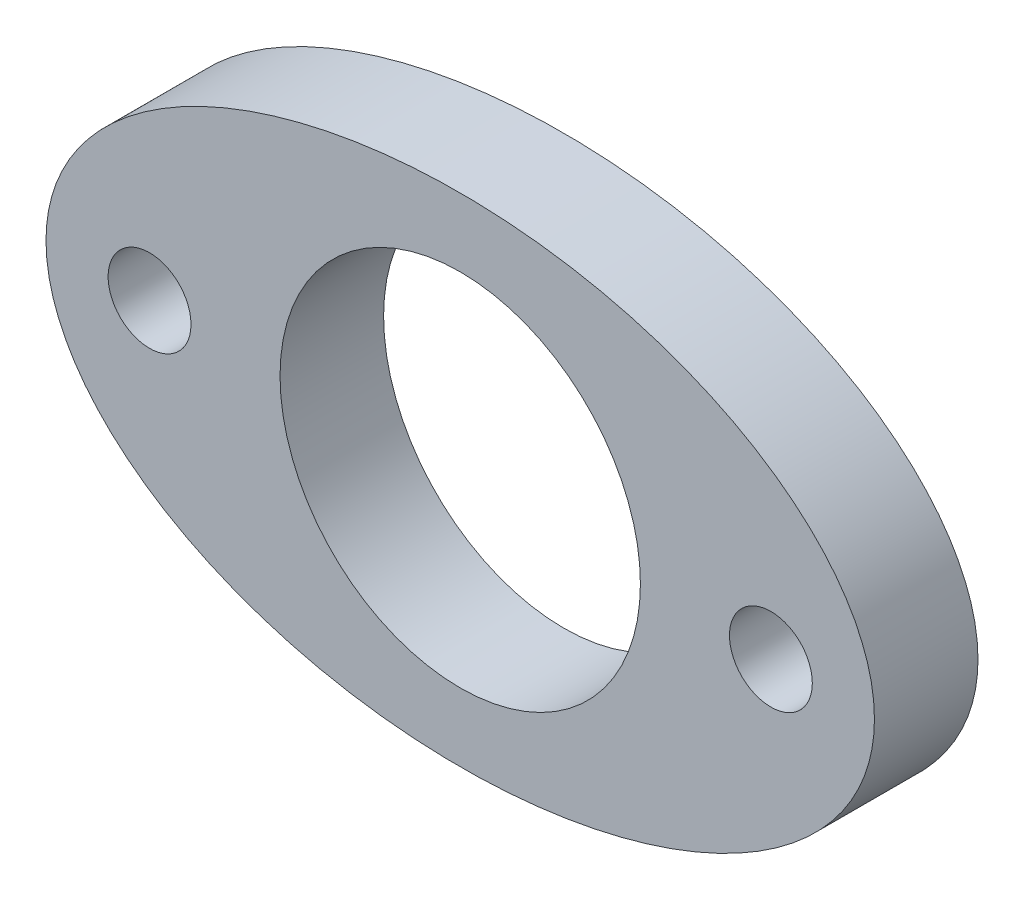
ISO-10303-21;
HEADER;
FILE_DESCRIPTION(('STEP AP214'),'2;1');
FILE_NAME('part.step','',(''),(''),'','','');
FILE_SCHEMA(('AUTOMOTIVE_DESIGN { 1 0 10303 214 1 1 1 1 }'));
ENDSEC;
DATA;
#1=APPLICATION_CONTEXT('core data for automotive mechanical design processes');
#2=APPLICATION_PROTOCOL_DEFINITION('international standard','automotive_design',2000,#1);
#3=PRODUCT_CONTEXT('',#1,'mechanical');
#4=PRODUCT('Part','Part','',(#3));
#5=PRODUCT_RELATED_PRODUCT_CATEGORY('part','',(#4));
#6=PRODUCT_DEFINITION_FORMATION('','',#4);
#7=PRODUCT_DEFINITION_CONTEXT('part definition',#1,'design');
#8=PRODUCT_DEFINITION('design','',#6,#7);
#9=PRODUCT_DEFINITION_SHAPE('','',#8);
#10=(LENGTH_UNIT() NAMED_UNIT(*) SI_UNIT(.MILLI.,.METRE.));
#11=(NAMED_UNIT(*) PLANE_ANGLE_UNIT() SI_UNIT($,.RADIAN.));
#12=(NAMED_UNIT(*) SI_UNIT($,.STERADIAN.) SOLID_ANGLE_UNIT());
#13=UNCERTAINTY_MEASURE_WITH_UNIT(LENGTH_MEASURE(1.E-05),#10,'distance_accuracy_value','');
#14=(GEOMETRIC_REPRESENTATION_CONTEXT(3) GLOBAL_UNCERTAINTY_ASSIGNED_CONTEXT((#13)) GLOBAL_UNIT_ASSIGNED_CONTEXT((#10,
#11,#12)) REPRESENTATION_CONTEXT('',''));
#15=CARTESIAN_POINT('',(0.,0.,0.));
#16=DIRECTION('',(0.,0.,1.));
#17=DIRECTION('',(1.,0.,0.));
#18=AXIS2_PLACEMENT_3D('',#15,#16,#17);
#19=CARTESIAN_POINT('',(0.,0.,6.35));
#20=DIRECTION('',(0.,0.,1.));
#21=DIRECTION('',(1.,0.,0.));
#22=AXIS2_PLACEMENT_3D('',#19,#20,#21);
#23=PLANE('',#22);
#24=CARTESIAN_POINT('',(-19.05,0.,6.35));
#25=DIRECTION('',(0.,0.,1.));
#26=DIRECTION('',(1.,0.,0.));
#27=AXIS2_PLACEMENT_3D('',#24,#25,#26);
#28=CIRCLE('',#27,2.54);
#29=CARTESIAN_POINT('',(-16.51,0.,6.35));
#30=VERTEX_POINT('',#29);
#31=EDGE_CURVE('E52',#30,#30,#28,.T.);
#32=ORIENTED_EDGE('',*,*,#31,.F.);
#33=EDGE_LOOP('',(#32));
#34=FACE_BOUND('',#33,.T.);
#35=CARTESIAN_POINT('',(0.,0.,6.35));
#36=DIRECTION('',(0.,0.,1.));
#37=DIRECTION('',(1.,0.,0.));
#38=AXIS2_PLACEMENT_3D('',#35,#36,#37);
#39=ELLIPSE('',#38,25.4,15.24);
#40=CARTESIAN_POINT('',(25.4,0.,6.35));
#41=VERTEX_POINT('',#40);
#42=EDGE_CURVE('E10',#41,#41,#39,.T.);
#43=ORIENTED_EDGE('',*,*,#42,.T.);
#44=EDGE_LOOP('',(#43));
#45=FACE_BOUND('',#44,.T.);
#46=CARTESIAN_POINT('',(0.,0.,6.35));
#47=DIRECTION('',(0.,0.,1.));
#48=DIRECTION('',(1.,0.,0.));
#49=AXIS2_PLACEMENT_3D('',#46,#47,#48);
#50=CIRCLE('',#49,11.049);
#51=CARTESIAN_POINT('',(11.049,0.,6.35));
#52=VERTEX_POINT('',#51);
#53=EDGE_CURVE('E46',#52,#52,#50,.T.);
#54=ORIENTED_EDGE('',*,*,#53,.F.);
#55=EDGE_LOOP('',(#54));
#56=FACE_BOUND('',#55,.T.);
#57=CARTESIAN_POINT('',(19.05,0.,6.35));
#58=DIRECTION('',(0.,0.,1.));
#59=DIRECTION('',(1.,0.,0.));
#60=AXIS2_PLACEMENT_3D('',#57,#58,#59);
#61=CIRCLE('',#60,2.54);
#62=CARTESIAN_POINT('',(21.59,0.,6.35));
#63=VERTEX_POINT('',#62);
#64=EDGE_CURVE('E58',#63,#63,#61,.T.);
#65=ORIENTED_EDGE('',*,*,#64,.F.);
#66=EDGE_LOOP('',(#65));
#67=FACE_BOUND('',#66,.T.);
#68=ADVANCED_FACE('F35',(#34,#45,#56,#67),#23,.T.);
#69=CARTESIAN_POINT('',(0.,0.,0.));
#70=DIRECTION('',(0.,0.,1.));
#71=DIRECTION('',(1.,0.,0.));
#72=AXIS2_PLACEMENT_3D('',#69,#70,#71);
#73=PLANE('',#72);
#74=CARTESIAN_POINT('',(0.,0.,0.));
#75=DIRECTION('',(0.,0.,1.));
#76=DIRECTION('',(1.,0.,0.));
#77=AXIS2_PLACEMENT_3D('',#74,#75,#76);
#78=ELLIPSE('',#77,25.4,15.24);
#79=CARTESIAN_POINT('',(25.4,0.,0.));
#80=VERTEX_POINT('',#79);
#81=EDGE_CURVE('E40',#80,#80,#78,.T.);
#82=ORIENTED_EDGE('',*,*,#81,.F.);
#83=EDGE_LOOP('',(#82));
#84=FACE_BOUND('',#83,.T.);
#85=CARTESIAN_POINT('',(0.,0.,0.));
#86=DIRECTION('',(0.,0.,1.));
#87=DIRECTION('',(1.,0.,0.));
#88=AXIS2_PLACEMENT_3D('',#85,#86,#87);
#89=CIRCLE('',#88,11.049);
#90=CARTESIAN_POINT('',(11.049,0.,0.));
#91=VERTEX_POINT('',#90);
#92=EDGE_CURVE('E49',#91,#91,#89,.T.);
#93=ORIENTED_EDGE('',*,*,#92,.T.);
#94=EDGE_LOOP('',(#93));
#95=FACE_BOUND('',#94,.T.);
#96=CARTESIAN_POINT('',(-19.05,0.,0.));
#97=DIRECTION('',(0.,0.,1.));
#98=DIRECTION('',(1.,0.,0.));
#99=AXIS2_PLACEMENT_3D('',#96,#97,#98);
#100=CIRCLE('',#99,2.54);
#101=CARTESIAN_POINT('',(-16.51,0.,0.));
#102=VERTEX_POINT('',#101);
#103=EDGE_CURVE('E55',#102,#102,#100,.T.);
#104=ORIENTED_EDGE('',*,*,#103,.T.);
#105=EDGE_LOOP('',(#104));
#106=FACE_BOUND('',#105,.T.);
#107=CARTESIAN_POINT('',(19.05,0.,0.));
#108=DIRECTION('',(0.,0.,1.));
#109=DIRECTION('',(1.,0.,0.));
#110=AXIS2_PLACEMENT_3D('',#107,#108,#109);
#111=CIRCLE('',#110,2.54);
#112=CARTESIAN_POINT('',(21.59,0.,0.));
#113=VERTEX_POINT('',#112);
#114=EDGE_CURVE('E61',#113,#113,#111,.T.);
#115=ORIENTED_EDGE('',*,*,#114,.T.);
#116=EDGE_LOOP('',(#115));
#117=FACE_BOUND('',#116,.T.);
#118=ADVANCED_FACE('F71',(#84,#95,#106,#117),#73,.F.);
#119=DIRECTION('',(0.,0.,-1.));
#120=VECTOR('',#119,1.);
#121=SURFACE_OF_LINEAR_EXTRUSION('',#39,#120);
#122=ORIENTED_EDGE('',*,*,#42,.F.);
#123=EDGE_LOOP('',(#122));
#124=FACE_BOUND('',#123,.T.);
#125=ORIENTED_EDGE('',*,*,#81,.T.);
#126=EDGE_LOOP('',(#125));
#127=FACE_BOUND('',#126,.T.);
#128=ADVANCED_FACE('F37',(#124,#127),#121,.F.);
#129=CARTESIAN_POINT('',(0.,0.,6.35));
#130=DIRECTION('',(0.,0.,-1.));
#131=DIRECTION('',(-1.,0.,0.));
#132=AXIS2_PLACEMENT_3D('',#129,#130,#131);
#133=CYLINDRICAL_SURFACE('',#132,11.049);
#134=ORIENTED_EDGE('',*,*,#53,.T.);
#135=EDGE_LOOP('',(#134));
#136=FACE_BOUND('',#135,.T.);
#137=ORIENTED_EDGE('',*,*,#92,.F.);
#138=EDGE_LOOP('',(#137));
#139=FACE_BOUND('',#138,.T.);
#140=ADVANCED_FACE('F80',(#136,#139),#133,.F.);
#141=CARTESIAN_POINT('',(-19.05,0.,6.35));
#142=DIRECTION('',(0.,0.,-1.));
#143=DIRECTION('',(-1.,0.,0.));
#144=AXIS2_PLACEMENT_3D('',#141,#142,#143);
#145=CYLINDRICAL_SURFACE('',#144,2.54);
#146=ORIENTED_EDGE('',*,*,#31,.T.);
#147=EDGE_LOOP('',(#146));
#148=FACE_BOUND('',#147,.T.);
#149=ORIENTED_EDGE('',*,*,#103,.F.);
#150=EDGE_LOOP('',(#149));
#151=FACE_BOUND('',#150,.T.);
#152=ADVANCED_FACE('F83',(#148,#151),#145,.F.);
#153=CARTESIAN_POINT('',(19.05,0.,6.35));
#154=DIRECTION('',(0.,0.,-1.));
#155=DIRECTION('',(-1.,0.,0.));
#156=AXIS2_PLACEMENT_3D('',#153,#154,#155);
#157=CYLINDRICAL_SURFACE('',#156,2.54);
#158=ORIENTED_EDGE('',*,*,#64,.T.);
#159=EDGE_LOOP('',(#158));
#160=FACE_BOUND('',#159,.T.);
#161=ORIENTED_EDGE('',*,*,#114,.F.);
#162=EDGE_LOOP('',(#161));
#163=FACE_BOUND('',#162,.T.);
#164=ADVANCED_FACE('F67',(#160,#163),#157,.F.);
#165=CLOSED_SHELL('',(#68,#118,#128,#140,#152,#164));
#166=MANIFOLD_SOLID_BREP('B2',#165);
#167=ADVANCED_BREP_SHAPE_REPRESENTATION('',(#18,#166),#14);
#168=SHAPE_DEFINITION_REPRESENTATION(#9,#167);
ENDSEC;
END-ISO-10303-21;
